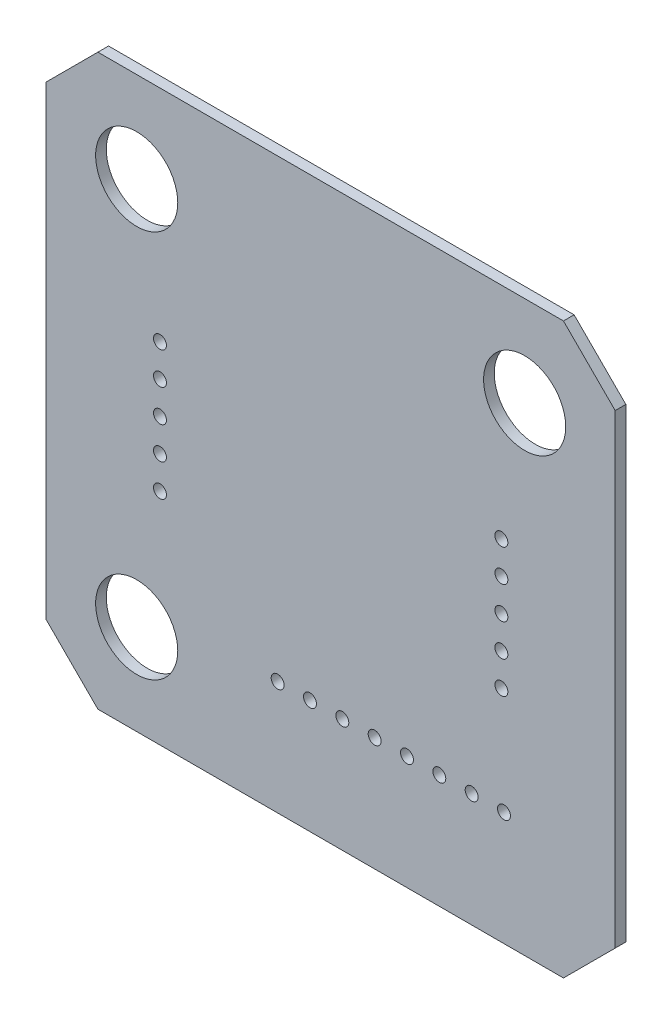
ISO-10303-21;
HEADER;
FILE_DESCRIPTION(('STEP AP214'),'2;1');
FILE_NAME('part.step','',(''),(''),'','','');
FILE_SCHEMA(('AUTOMOTIVE_DESIGN { 1 0 10303 214 1 1 1 1 }'));
ENDSEC;
DATA;
#1=APPLICATION_CONTEXT('core data for automotive mechanical design processes');
#2=APPLICATION_PROTOCOL_DEFINITION('international standard','automotive_design',2000,#1);
#3=PRODUCT_CONTEXT('',#1,'mechanical');
#4=PRODUCT('Part','Part','',(#3));
#5=PRODUCT_RELATED_PRODUCT_CATEGORY('part','',(#4));
#6=PRODUCT_DEFINITION_FORMATION('','',#4);
#7=PRODUCT_DEFINITION_CONTEXT('part definition',#1,'design');
#8=PRODUCT_DEFINITION('design','',#6,#7);
#9=PRODUCT_DEFINITION_SHAPE('','',#8);
#10=(LENGTH_UNIT() NAMED_UNIT(*) SI_UNIT(.MILLI.,.METRE.));
#11=(NAMED_UNIT(*) PLANE_ANGLE_UNIT() SI_UNIT($,.RADIAN.));
#12=(NAMED_UNIT(*) SI_UNIT($,.STERADIAN.) SOLID_ANGLE_UNIT());
#13=UNCERTAINTY_MEASURE_WITH_UNIT(LENGTH_MEASURE(1.E-05),#10,'distance_accuracy_value','');
#14=(GEOMETRIC_REPRESENTATION_CONTEXT(3) GLOBAL_UNCERTAINTY_ASSIGNED_CONTEXT((#13)) GLOBAL_UNIT_ASSIGNED_CONTEXT((#10,
#11,#12)) REPRESENTATION_CONTEXT('',''));
#15=CARTESIAN_POINT('',(0.,0.,0.));
#16=DIRECTION('',(0.,0.,1.));
#17=DIRECTION('',(1.,0.,0.));
#18=AXIS2_PLACEMENT_3D('',#15,#16,#17);
#19=CARTESIAN_POINT('',(-11.,-9.,0.));
#20=DIRECTION('',(-1.,0.,0.));
#21=DIRECTION('',(0.,0.,1.));
#22=AXIS2_PLACEMENT_3D('',#19,#20,#21);
#23=PLANE('',#22);
#24=DIRECTION('',(0.,0.,1.));
#25=VECTOR('',#24,1.);
#26=CARTESIAN_POINT('',(-11.,-9.,0.));
#27=LINE('',#26,#25);
#28=CARTESIAN_POINT('',(-11.,-9.,0.));
#29=VERTEX_POINT('',#28);
#30=CARTESIAN_POINT('',(-11.,-9.,0.41148));
#31=VERTEX_POINT('',#30);
#32=EDGE_CURVE('E11',#29,#31,#27,.T.);
#33=ORIENTED_EDGE('',*,*,#32,.T.);
#34=DIRECTION('',(0.,1.,0.));
#35=VECTOR('',#34,1.);
#36=CARTESIAN_POINT('',(-11.,-9.,0.41148));
#37=LINE('',#36,#35);
#38=CARTESIAN_POINT('',(-11.,9.,0.41148));
#39=VERTEX_POINT('',#38);
#40=EDGE_CURVE('E24',#31,#39,#37,.T.);
#41=ORIENTED_EDGE('',*,*,#40,.T.);
#42=DIRECTION('',(0.,0.,1.));
#43=VECTOR('',#42,1.);
#44=CARTESIAN_POINT('',(-11.,9.,0.));
#45=LINE('',#44,#43);
#46=CARTESIAN_POINT('',(-11.,9.,0.));
#47=VERTEX_POINT('',#46);
#48=EDGE_CURVE('E429',#47,#39,#45,.T.);
#49=ORIENTED_EDGE('',*,*,#48,.F.);
#50=DIRECTION('',(0.,1.,0.));
#51=VECTOR('',#50,1.);
#52=CARTESIAN_POINT('',(-11.,-9.,0.));
#53=LINE('',#52,#51);
#54=EDGE_CURVE('E426',#29,#47,#53,.T.);
#55=ORIENTED_EDGE('',*,*,#54,.F.);
#56=EDGE_LOOP('',(#33,#41,#49,#55));
#57=FACE_BOUND('',#56,.T.);
#58=ADVANCED_FACE('F17',(#57),#23,.T.);
#59=CARTESIAN_POINT('',(-11.,9.,0.));
#60=DIRECTION('',(-0.707106781186548,0.707106781186548,0.));
#61=DIRECTION('',(0.,0.,1.));
#62=AXIS2_PLACEMENT_3D('',#59,#60,#61);
#63=PLANE('',#62);
#64=ORIENTED_EDGE('',*,*,#48,.T.);
#65=DIRECTION('',(0.707106781186548,0.707106781186548,0.));
#66=VECTOR('',#65,1.);
#67=CARTESIAN_POINT('',(-11.,9.,0.41148));
#68=LINE('',#67,#66);
#69=CARTESIAN_POINT('',(-9.,11.,0.41148));
#70=VERTEX_POINT('',#69);
#71=EDGE_CURVE('E424',#39,#70,#68,.T.);
#72=ORIENTED_EDGE('',*,*,#71,.T.);
#73=DIRECTION('',(0.,0.,1.));
#74=VECTOR('',#73,1.);
#75=CARTESIAN_POINT('',(-9.,11.,0.));
#76=LINE('',#75,#74);
#77=CARTESIAN_POINT('',(-9.,11.,0.));
#78=VERTEX_POINT('',#77);
#79=EDGE_CURVE('E421',#78,#70,#76,.T.);
#80=ORIENTED_EDGE('',*,*,#79,.F.);
#81=DIRECTION('',(0.707106781186548,0.707106781186548,0.));
#82=VECTOR('',#81,1.);
#83=CARTESIAN_POINT('',(-11.,9.,0.));
#84=LINE('',#83,#82);
#85=EDGE_CURVE('E418',#47,#78,#84,.T.);
#86=ORIENTED_EDGE('',*,*,#85,.F.);
#87=EDGE_LOOP('',(#64,#72,#80,#86));
#88=FACE_BOUND('',#87,.T.);
#89=ADVANCED_FACE('F433',(#88),#63,.T.);
#90=CARTESIAN_POINT('',(-9.,11.,0.));
#91=DIRECTION('',(0.,1.,0.));
#92=DIRECTION('',(1.,0.,0.));
#93=AXIS2_PLACEMENT_3D('',#90,#91,#92);
#94=PLANE('',#93);
#95=ORIENTED_EDGE('',*,*,#79,.T.);
#96=DIRECTION('',(1.,0.,0.));
#97=VECTOR('',#96,1.);
#98=CARTESIAN_POINT('',(-9.,11.,0.41148));
#99=LINE('',#98,#97);
#100=CARTESIAN_POINT('',(9.,11.,0.41148));
#101=VERTEX_POINT('',#100);
#102=EDGE_CURVE('E416',#70,#101,#99,.T.);
#103=ORIENTED_EDGE('',*,*,#102,.T.);
#104=DIRECTION('',(0.,0.,1.));
#105=VECTOR('',#104,1.);
#106=CARTESIAN_POINT('',(9.,11.,0.));
#107=LINE('',#106,#105);
#108=CARTESIAN_POINT('',(9.,11.,0.));
#109=VERTEX_POINT('',#108);
#110=EDGE_CURVE('E413',#109,#101,#107,.T.);
#111=ORIENTED_EDGE('',*,*,#110,.F.);
#112=DIRECTION('',(1.,0.,0.));
#113=VECTOR('',#112,1.);
#114=CARTESIAN_POINT('',(-9.,11.,0.));
#115=LINE('',#114,#113);
#116=EDGE_CURVE('E410',#78,#109,#115,.T.);
#117=ORIENTED_EDGE('',*,*,#116,.F.);
#118=EDGE_LOOP('',(#95,#103,#111,#117));
#119=FACE_BOUND('',#118,.T.);
#120=ADVANCED_FACE('F442',(#119),#94,.T.);
#121=CARTESIAN_POINT('',(9.,11.,0.));
#122=DIRECTION('',(0.707106781186548,0.707106781186548,0.));
#123=DIRECTION('',(0.,0.,-1.));
#124=AXIS2_PLACEMENT_3D('',#121,#122,#123);
#125=PLANE('',#124);
#126=ORIENTED_EDGE('',*,*,#110,.T.);
#127=DIRECTION('',(0.707106781186548,-0.707106781186548,0.));
#128=VECTOR('',#127,1.);
#129=CARTESIAN_POINT('',(9.,11.,0.41148));
#130=LINE('',#129,#128);
#131=CARTESIAN_POINT('',(11.,9.,0.41148));
#132=VERTEX_POINT('',#131);
#133=EDGE_CURVE('E408',#101,#132,#130,.T.);
#134=ORIENTED_EDGE('',*,*,#133,.T.);
#135=DIRECTION('',(0.,0.,1.));
#136=VECTOR('',#135,1.);
#137=CARTESIAN_POINT('',(11.,9.,0.));
#138=LINE('',#137,#136);
#139=CARTESIAN_POINT('',(11.,9.,0.));
#140=VERTEX_POINT('',#139);
#141=EDGE_CURVE('E405',#140,#132,#138,.T.);
#142=ORIENTED_EDGE('',*,*,#141,.F.);
#143=DIRECTION('',(0.707106781186548,-0.707106781186548,0.));
#144=VECTOR('',#143,1.);
#145=CARTESIAN_POINT('',(9.,11.,0.));
#146=LINE('',#145,#144);
#147=EDGE_CURVE('E402',#109,#140,#146,.T.);
#148=ORIENTED_EDGE('',*,*,#147,.F.);
#149=EDGE_LOOP('',(#126,#134,#142,#148));
#150=FACE_BOUND('',#149,.T.);
#151=ADVANCED_FACE('F446',(#150),#125,.T.);
#152=CARTESIAN_POINT('',(11.,9.,0.));
#153=DIRECTION('',(1.,0.,0.));
#154=DIRECTION('',(0.,1.,0.));
#155=AXIS2_PLACEMENT_3D('',#152,#153,#154);
#156=PLANE('',#155);
#157=ORIENTED_EDGE('',*,*,#141,.T.);
#158=DIRECTION('',(0.,-1.,0.));
#159=VECTOR('',#158,1.);
#160=CARTESIAN_POINT('',(11.,9.,0.41148));
#161=LINE('',#160,#159);
#162=CARTESIAN_POINT('',(11.,-9.,0.41148));
#163=VERTEX_POINT('',#162);
#164=EDGE_CURVE('E400',#132,#163,#161,.T.);
#165=ORIENTED_EDGE('',*,*,#164,.T.);
#166=DIRECTION('',(0.,0.,1.));
#167=VECTOR('',#166,1.);
#168=CARTESIAN_POINT('',(11.,-9.,0.));
#169=LINE('',#168,#167);
#170=CARTESIAN_POINT('',(11.,-9.,0.));
#171=VERTEX_POINT('',#170);
#172=EDGE_CURVE('E397',#171,#163,#169,.T.);
#173=ORIENTED_EDGE('',*,*,#172,.F.);
#174=DIRECTION('',(0.,-1.,0.));
#175=VECTOR('',#174,1.);
#176=CARTESIAN_POINT('',(11.,9.,0.));
#177=LINE('',#176,#175);
#178=EDGE_CURVE('E394',#140,#171,#177,.T.);
#179=ORIENTED_EDGE('',*,*,#178,.F.);
#180=EDGE_LOOP('',(#157,#165,#173,#179));
#181=FACE_BOUND('',#180,.T.);
#182=ADVANCED_FACE('F463',(#181),#156,.T.);
#183=CARTESIAN_POINT('',(11.,-9.,0.));
#184=DIRECTION('',(0.707106781186548,-0.707106781186548,0.));
#185=DIRECTION('',(0.,0.,-1.));
#186=AXIS2_PLACEMENT_3D('',#183,#184,#185);
#187=PLANE('',#186);
#188=ORIENTED_EDGE('',*,*,#172,.T.);
#189=DIRECTION('',(-0.707106781186548,-0.707106781186548,0.));
#190=VECTOR('',#189,1.);
#191=CARTESIAN_POINT('',(11.,-9.,0.41148));
#192=LINE('',#191,#190);
#193=CARTESIAN_POINT('',(9.,-11.,0.41148));
#194=VERTEX_POINT('',#193);
#195=EDGE_CURVE('E392',#163,#194,#192,.T.);
#196=ORIENTED_EDGE('',*,*,#195,.T.);
#197=DIRECTION('',(0.,0.,1.));
#198=VECTOR('',#197,1.);
#199=CARTESIAN_POINT('',(9.,-11.,0.));
#200=LINE('',#199,#198);
#201=CARTESIAN_POINT('',(9.,-11.,0.));
#202=VERTEX_POINT('',#201);
#203=EDGE_CURVE('E389',#202,#194,#200,.T.);
#204=ORIENTED_EDGE('',*,*,#203,.F.);
#205=DIRECTION('',(-0.707106781186548,-0.707106781186548,0.));
#206=VECTOR('',#205,1.);
#207=CARTESIAN_POINT('',(11.,-9.,0.));
#208=LINE('',#207,#206);
#209=EDGE_CURVE('E386',#171,#202,#208,.T.);
#210=ORIENTED_EDGE('',*,*,#209,.F.);
#211=EDGE_LOOP('',(#188,#196,#204,#210));
#212=FACE_BOUND('',#211,.T.);
#213=ADVANCED_FACE('F461',(#212),#187,.T.);
#214=CARTESIAN_POINT('',(9.,-11.,0.));
#215=DIRECTION('',(0.,-1.,0.));
#216=DIRECTION('',(0.,0.,-1.));
#217=AXIS2_PLACEMENT_3D('',#214,#215,#216);
#218=PLANE('',#217);
#219=ORIENTED_EDGE('',*,*,#203,.T.);
#220=DIRECTION('',(-1.,0.,0.));
#221=VECTOR('',#220,1.);
#222=CARTESIAN_POINT('',(9.,-11.,0.41148));
#223=LINE('',#222,#221);
#224=CARTESIAN_POINT('',(-9.,-11.,0.41148));
#225=VERTEX_POINT('',#224);
#226=EDGE_CURVE('E384',#194,#225,#223,.T.);
#227=ORIENTED_EDGE('',*,*,#226,.T.);
#228=DIRECTION('',(0.,0.,1.));
#229=VECTOR('',#228,1.);
#230=CARTESIAN_POINT('',(-9.,-11.,0.));
#231=LINE('',#230,#229);
#232=CARTESIAN_POINT('',(-9.,-11.,0.));
#233=VERTEX_POINT('',#232);
#234=EDGE_CURVE('E381',#233,#225,#231,.T.);
#235=ORIENTED_EDGE('',*,*,#234,.F.);
#236=DIRECTION('',(-1.,0.,0.));
#237=VECTOR('',#236,1.);
#238=CARTESIAN_POINT('',(9.,-11.,0.));
#239=LINE('',#238,#237);
#240=EDGE_CURVE('E378',#202,#233,#239,.T.);
#241=ORIENTED_EDGE('',*,*,#240,.F.);
#242=EDGE_LOOP('',(#219,#227,#235,#241));
#243=FACE_BOUND('',#242,.T.);
#244=ADVANCED_FACE('F457',(#243),#218,.T.);
#245=CARTESIAN_POINT('',(-9.,-11.,0.));
#246=DIRECTION('',(-0.707106781186548,-0.707106781186548,0.));
#247=DIRECTION('',(-0.707106781186548,0.707106781186548,0.));
#248=AXIS2_PLACEMENT_3D('',#245,#246,#247);
#249=PLANE('',#248);
#250=ORIENTED_EDGE('',*,*,#234,.T.);
#251=DIRECTION('',(-0.707106781186548,0.707106781186548,0.));
#252=VECTOR('',#251,1.);
#253=CARTESIAN_POINT('',(-9.,-11.,0.41148));
#254=LINE('',#253,#252);
#255=EDGE_CURVE('E376',#225,#31,#254,.T.);
#256=ORIENTED_EDGE('',*,*,#255,.T.);
#257=ORIENTED_EDGE('',*,*,#32,.F.);
#258=DIRECTION('',(-0.707106781186548,0.707106781186548,0.));
#259=VECTOR('',#258,1.);
#260=CARTESIAN_POINT('',(-9.,-11.,0.));
#261=LINE('',#260,#259);
#262=EDGE_CURVE('E373',#233,#29,#261,.T.);
#263=ORIENTED_EDGE('',*,*,#262,.F.);
#264=EDGE_LOOP('',(#250,#256,#257,#263));
#265=FACE_BOUND('',#264,.T.);
#266=ADVANCED_FACE('F453',(#265),#249,.T.);
#267=CARTESIAN_POINT('',(-7.50000024,-7.50000024,0.));
#268=DIRECTION('',(0.,0.,-1.));
#269=DIRECTION('',(1.,0.,0.));
#270=AXIS2_PLACEMENT_3D('',#267,#268,#269);
#271=CYLINDRICAL_SURFACE('',#270,1.5875);
#272=DIRECTION('',(0.,0.,1.));
#273=VECTOR('',#272,1.);
#274=CARTESIAN_POINT('',(-5.91250024,-7.50000024,0.));
#275=LINE('',#274,#273);
#276=CARTESIAN_POINT('',(-5.91250024,-7.50000024,0.));
#277=VERTEX_POINT('',#276);
#278=CARTESIAN_POINT('',(-5.91250024,-7.50000024,0.41148));
#279=VERTEX_POINT('',#278);
#280=EDGE_CURVE('E371',#277,#279,#275,.T.);
#281=ORIENTED_EDGE('',*,*,#280,.T.);
#282=CARTESIAN_POINT('',(-7.50000024,-7.50000024,0.41148));
#283=DIRECTION('',(0.,0.,1.));
#284=DIRECTION('',(1.,0.,0.));
#285=AXIS2_PLACEMENT_3D('',#282,#283,#284);
#286=CIRCLE('',#285,1.5875);
#287=EDGE_CURVE('E368',#279,#279,#286,.T.);
#288=ORIENTED_EDGE('',*,*,#287,.T.);
#289=ORIENTED_EDGE('',*,*,#280,.F.);
#290=CARTESIAN_POINT('',(-7.50000024,-7.50000024,0.));
#291=DIRECTION('',(0.,0.,1.));
#292=DIRECTION('',(1.,0.,0.));
#293=AXIS2_PLACEMENT_3D('',#290,#291,#292);
#294=CIRCLE('',#293,1.5875);
#295=EDGE_CURVE('E365',#277,#277,#294,.T.);
#296=ORIENTED_EDGE('',*,*,#295,.F.);
#297=EDGE_LOOP('',(#281,#288,#289,#296));
#298=FACE_BOUND('',#297,.T.);
#299=ADVANCED_FACE('F522',(#298),#271,.F.);
#300=CARTESIAN_POINT('',(-6.5999995,-2.50000008,0.));
#301=DIRECTION('',(0.,0.,-1.));
#302=DIRECTION('',(1.,0.,0.));
#303=AXIS2_PLACEMENT_3D('',#300,#301,#302);
#304=CYLINDRICAL_SURFACE('',#303,0.2499995);
#305=DIRECTION('',(0.,0.,1.));
#306=VECTOR('',#305,1.);
#307=CARTESIAN_POINT('',(-6.35,-2.50000008,0.));
#308=LINE('',#307,#306);
#309=CARTESIAN_POINT('',(-6.35,-2.50000008,0.));
#310=VERTEX_POINT('',#309);
#311=CARTESIAN_POINT('',(-6.35,-2.50000008,0.41148));
#312=VERTEX_POINT('',#311);
#313=EDGE_CURVE('E363',#310,#312,#308,.T.);
#314=ORIENTED_EDGE('',*,*,#313,.T.);
#315=CARTESIAN_POINT('',(-6.5999995,-2.50000008,0.41148));
#316=DIRECTION('',(0.,0.,1.));
#317=DIRECTION('',(1.,0.,0.));
#318=AXIS2_PLACEMENT_3D('',#315,#316,#317);
#319=CIRCLE('',#318,0.2499995);
#320=EDGE_CURVE('E360',#312,#312,#319,.T.);
#321=ORIENTED_EDGE('',*,*,#320,.T.);
#322=ORIENTED_EDGE('',*,*,#313,.F.);
#323=CARTESIAN_POINT('',(-6.5999995,-2.50000008,0.));
#324=DIRECTION('',(0.,0.,1.));
#325=DIRECTION('',(1.,0.,0.));
#326=AXIS2_PLACEMENT_3D('',#323,#324,#325);
#327=CIRCLE('',#326,0.2499995);
#328=EDGE_CURVE('E357',#310,#310,#327,.T.);
#329=ORIENTED_EDGE('',*,*,#328,.F.);
#330=EDGE_LOOP('',(#314,#321,#322,#329));
#331=FACE_BOUND('',#330,.T.);
#332=ADVANCED_FACE('F531',(#331),#304,.F.);
#333=CARTESIAN_POINT('',(0.4499991,-6.5999995,0.));
#334=DIRECTION('',(0.,0.,-1.));
#335=DIRECTION('',(1.,0.,0.));
#336=AXIS2_PLACEMENT_3D('',#333,#334,#335);
#337=CYLINDRICAL_SURFACE('',#336,0.2499995);
#338=DIRECTION('',(0.,0.,1.));
#339=VECTOR('',#338,1.);
#340=CARTESIAN_POINT('',(0.6999986,-6.5999995,0.));
#341=LINE('',#340,#339);
#342=CARTESIAN_POINT('',(0.6999986,-6.5999995,0.));
#343=VERTEX_POINT('',#342);
#344=CARTESIAN_POINT('',(0.6999986,-6.5999995,0.41148));
#345=VERTEX_POINT('',#344);
#346=EDGE_CURVE('E355',#343,#345,#341,.T.);
#347=ORIENTED_EDGE('',*,*,#346,.T.);
#348=CARTESIAN_POINT('',(0.4499991,-6.5999995,0.41148));
#349=DIRECTION('',(0.,0.,1.));
#350=DIRECTION('',(1.,0.,0.));
#351=AXIS2_PLACEMENT_3D('',#348,#349,#350);
#352=CIRCLE('',#351,0.2499995);
#353=EDGE_CURVE('E352',#345,#345,#352,.T.);
#354=ORIENTED_EDGE('',*,*,#353,.T.);
#355=ORIENTED_EDGE('',*,*,#346,.F.);
#356=CARTESIAN_POINT('',(0.4499991,-6.5999995,0.));
#357=DIRECTION('',(0.,0.,1.));
#358=DIRECTION('',(1.,0.,0.));
#359=AXIS2_PLACEMENT_3D('',#356,#357,#358);
#360=CIRCLE('',#359,0.2499995);
#361=EDGE_CURVE('E349',#343,#343,#360,.T.);
#362=ORIENTED_EDGE('',*,*,#361,.F.);
#363=EDGE_LOOP('',(#347,#354,#355,#362));
#364=FACE_BOUND('',#363,.T.);
#365=ADVANCED_FACE('F541',(#364),#337,.F.);
#366=CARTESIAN_POINT('',(-2.05000098,-6.5999995,0.));
#367=DIRECTION('',(0.,0.,-1.));
#368=DIRECTION('',(1.,0.,0.));
#369=AXIS2_PLACEMENT_3D('',#366,#367,#368);
#370=CYLINDRICAL_SURFACE('',#369,0.2499995);
#371=DIRECTION('',(0.,0.,1.));
#372=VECTOR('',#371,1.);
#373=CARTESIAN_POINT('',(-1.80000148,-6.5999995,0.));
#374=LINE('',#373,#372);
#375=CARTESIAN_POINT('',(-1.80000148,-6.5999995,0.));
#376=VERTEX_POINT('',#375);
#377=CARTESIAN_POINT('',(-1.80000148,-6.5999995,0.41148));
#378=VERTEX_POINT('',#377);
#379=EDGE_CURVE('E347',#376,#378,#374,.T.);
#380=ORIENTED_EDGE('',*,*,#379,.T.);
#381=CARTESIAN_POINT('',(-2.05000098,-6.5999995,0.41148));
#382=DIRECTION('',(0.,0.,1.));
#383=DIRECTION('',(1.,0.,0.));
#384=AXIS2_PLACEMENT_3D('',#381,#382,#383);
#385=CIRCLE('',#384,0.2499995);
#386=EDGE_CURVE('E344',#378,#378,#385,.T.);
#387=ORIENTED_EDGE('',*,*,#386,.T.);
#388=ORIENTED_EDGE('',*,*,#379,.F.);
#389=CARTESIAN_POINT('',(-2.05000098,-6.5999995,0.));
#390=DIRECTION('',(0.,0.,1.));
#391=DIRECTION('',(1.,0.,0.));
#392=AXIS2_PLACEMENT_3D('',#389,#390,#391);
#393=CIRCLE('',#392,0.2499995);
#394=EDGE_CURVE('E341',#376,#376,#393,.T.);
#395=ORIENTED_EDGE('',*,*,#394,.F.);
#396=EDGE_LOOP('',(#380,#387,#388,#395));
#397=FACE_BOUND('',#396,.T.);
#398=ADVANCED_FACE('F551',(#397),#370,.F.);
#399=CARTESIAN_POINT('',(-0.80000094,-6.5999995,0.));
#400=DIRECTION('',(0.,0.,-1.));
#401=DIRECTION('',(1.,0.,0.));
#402=AXIS2_PLACEMENT_3D('',#399,#400,#401);
#403=CYLINDRICAL_SURFACE('',#402,0.2499995);
#404=DIRECTION('',(0.,0.,1.));
#405=VECTOR('',#404,1.);
#406=CARTESIAN_POINT('',(-0.55000144,-6.5999995,0.));
#407=LINE('',#406,#405);
#408=CARTESIAN_POINT('',(-0.55000144,-6.5999995,0.));
#409=VERTEX_POINT('',#408);
#410=CARTESIAN_POINT('',(-0.55000144,-6.5999995,0.41148));
#411=VERTEX_POINT('',#410);
#412=EDGE_CURVE('E339',#409,#411,#407,.T.);
#413=ORIENTED_EDGE('',*,*,#412,.T.);
#414=CARTESIAN_POINT('',(-0.80000094,-6.5999995,0.41148));
#415=DIRECTION('',(0.,0.,1.));
#416=DIRECTION('',(1.,0.,0.));
#417=AXIS2_PLACEMENT_3D('',#414,#415,#416);
#418=CIRCLE('',#417,0.2499995);
#419=EDGE_CURVE('E336',#411,#411,#418,.T.);
#420=ORIENTED_EDGE('',*,*,#419,.T.);
#421=ORIENTED_EDGE('',*,*,#412,.F.);
#422=CARTESIAN_POINT('',(-0.80000094,-6.5999995,0.));
#423=DIRECTION('',(0.,0.,1.));
#424=DIRECTION('',(1.,0.,0.));
#425=AXIS2_PLACEMENT_3D('',#422,#423,#424);
#426=CIRCLE('',#425,0.2499995);
#427=EDGE_CURVE('E333',#409,#409,#426,.T.);
#428=ORIENTED_EDGE('',*,*,#427,.F.);
#429=EDGE_LOOP('',(#413,#420,#421,#428));
#430=FACE_BOUND('',#429,.T.);
#431=ADVANCED_FACE('F561',(#430),#403,.F.);
#432=CARTESIAN_POINT('',(-6.5999995,-1.25000004,0.));
#433=DIRECTION('',(0.,0.,-1.));
#434=DIRECTION('',(1.,0.,0.));
#435=AXIS2_PLACEMENT_3D('',#432,#433,#434);
#436=CYLINDRICAL_SURFACE('',#435,0.2499995);
#437=DIRECTION('',(0.,0.,1.));
#438=VECTOR('',#437,1.);
#439=CARTESIAN_POINT('',(-6.35,-1.25000004,0.));
#440=LINE('',#439,#438);
#441=CARTESIAN_POINT('',(-6.35,-1.25000004,0.));
#442=VERTEX_POINT('',#441);
#443=CARTESIAN_POINT('',(-6.35,-1.25000004,0.41148));
#444=VERTEX_POINT('',#443);
#445=EDGE_CURVE('E331',#442,#444,#440,.T.);
#446=ORIENTED_EDGE('',*,*,#445,.T.);
#447=CARTESIAN_POINT('',(-6.5999995,-1.25000004,0.41148));
#448=DIRECTION('',(0.,0.,1.));
#449=DIRECTION('',(1.,0.,0.));
#450=AXIS2_PLACEMENT_3D('',#447,#448,#449);
#451=CIRCLE('',#450,0.2499995);
#452=EDGE_CURVE('E328',#444,#444,#451,.T.);
#453=ORIENTED_EDGE('',*,*,#452,.T.);
#454=ORIENTED_EDGE('',*,*,#445,.F.);
#455=CARTESIAN_POINT('',(-6.5999995,-1.25000004,0.));
#456=DIRECTION('',(0.,0.,1.));
#457=DIRECTION('',(1.,0.,0.));
#458=AXIS2_PLACEMENT_3D('',#455,#456,#457);
#459=CIRCLE('',#458,0.2499995);
#460=EDGE_CURVE('E325',#442,#442,#459,.T.);
#461=ORIENTED_EDGE('',*,*,#460,.F.);
#462=EDGE_LOOP('',(#446,#453,#454,#461));
#463=FACE_BOUND('',#462,.T.);
#464=ADVANCED_FACE('F571',(#463),#436,.F.);
#465=CARTESIAN_POINT('',(-6.5999995,0.,0.));
#466=DIRECTION('',(0.,0.,-1.));
#467=DIRECTION('',(1.,0.,0.));
#468=AXIS2_PLACEMENT_3D('',#465,#466,#467);
#469=CYLINDRICAL_SURFACE('',#468,0.2499995);
#470=DIRECTION('',(0.,0.,1.));
#471=VECTOR('',#470,1.);
#472=CARTESIAN_POINT('',(-6.35,0.,0.));
#473=LINE('',#472,#471);
#474=CARTESIAN_POINT('',(-6.35,0.,0.));
#475=VERTEX_POINT('',#474);
#476=CARTESIAN_POINT('',(-6.35,0.,0.41148));
#477=VERTEX_POINT('',#476);
#478=EDGE_CURVE('E323',#475,#477,#473,.T.);
#479=ORIENTED_EDGE('',*,*,#478,.T.);
#480=CARTESIAN_POINT('',(-6.5999995,0.,0.41148));
#481=DIRECTION('',(0.,0.,1.));
#482=DIRECTION('',(1.,0.,0.));
#483=AXIS2_PLACEMENT_3D('',#480,#481,#482);
#484=CIRCLE('',#483,0.2499995);
#485=EDGE_CURVE('E320',#477,#477,#484,.T.);
#486=ORIENTED_EDGE('',*,*,#485,.T.);
#487=ORIENTED_EDGE('',*,*,#478,.F.);
#488=CARTESIAN_POINT('',(-6.5999995,0.,0.));
#489=DIRECTION('',(0.,0.,1.));
#490=DIRECTION('',(1.,0.,0.));
#491=AXIS2_PLACEMENT_3D('',#488,#489,#490);
#492=CIRCLE('',#491,0.2499995);
#493=EDGE_CURVE('E317',#475,#475,#492,.T.);
#494=ORIENTED_EDGE('',*,*,#493,.F.);
#495=EDGE_LOOP('',(#479,#486,#487,#494));
#496=FACE_BOUND('',#495,.T.);
#497=ADVANCED_FACE('F581',(#496),#469,.F.);
#498=CARTESIAN_POINT('',(-6.5999995,1.25000004,0.));
#499=DIRECTION('',(0.,0.,-1.));
#500=DIRECTION('',(1.,0.,0.));
#501=AXIS2_PLACEMENT_3D('',#498,#499,#500);
#502=CYLINDRICAL_SURFACE('',#501,0.2499995);
#503=DIRECTION('',(0.,0.,1.));
#504=VECTOR('',#503,1.);
#505=CARTESIAN_POINT('',(-6.35,1.25000004,0.));
#506=LINE('',#505,#504);
#507=CARTESIAN_POINT('',(-6.35,1.25000004,0.));
#508=VERTEX_POINT('',#507);
#509=CARTESIAN_POINT('',(-6.35,1.25000004,0.41148));
#510=VERTEX_POINT('',#509);
#511=EDGE_CURVE('E315',#508,#510,#506,.T.);
#512=ORIENTED_EDGE('',*,*,#511,.T.);
#513=CARTESIAN_POINT('',(-6.5999995,1.25000004,0.41148));
#514=DIRECTION('',(0.,0.,1.));
#515=DIRECTION('',(1.,0.,0.));
#516=AXIS2_PLACEMENT_3D('',#513,#514,#515);
#517=CIRCLE('',#516,0.2499995);
#518=EDGE_CURVE('E312',#510,#510,#517,.T.);
#519=ORIENTED_EDGE('',*,*,#518,.T.);
#520=ORIENTED_EDGE('',*,*,#511,.F.);
#521=CARTESIAN_POINT('',(-6.5999995,1.25000004,0.));
#522=DIRECTION('',(0.,0.,1.));
#523=DIRECTION('',(1.,0.,0.));
#524=AXIS2_PLACEMENT_3D('',#521,#522,#523);
#525=CIRCLE('',#524,0.2499995);
#526=EDGE_CURVE('E309',#508,#508,#525,.T.);
#527=ORIENTED_EDGE('',*,*,#526,.F.);
#528=EDGE_LOOP('',(#512,#519,#520,#527));
#529=FACE_BOUND('',#528,.T.);
#530=ADVANCED_FACE('F591',(#529),#502,.F.);
#531=CARTESIAN_POINT('',(-7.50000024,7.50000024,0.));
#532=DIRECTION('',(0.,0.,-1.));
#533=DIRECTION('',(1.,0.,0.));
#534=AXIS2_PLACEMENT_3D('',#531,#532,#533);
#535=CYLINDRICAL_SURFACE('',#534,1.5875);
#536=DIRECTION('',(0.,0.,1.));
#537=VECTOR('',#536,1.);
#538=CARTESIAN_POINT('',(-5.91250024,7.50000024,0.));
#539=LINE('',#538,#537);
#540=CARTESIAN_POINT('',(-5.91250024,7.50000024,0.));
#541=VERTEX_POINT('',#540);
#542=CARTESIAN_POINT('',(-5.91250024,7.50000024,0.41148));
#543=VERTEX_POINT('',#542);
#544=EDGE_CURVE('E307',#541,#543,#539,.T.);
#545=ORIENTED_EDGE('',*,*,#544,.T.);
#546=CARTESIAN_POINT('',(-7.50000024,7.50000024,0.41148));
#547=DIRECTION('',(0.,0.,1.));
#548=DIRECTION('',(1.,0.,0.));
#549=AXIS2_PLACEMENT_3D('',#546,#547,#548);
#550=CIRCLE('',#549,1.5875);
#551=EDGE_CURVE('E304',#543,#543,#550,.T.);
#552=ORIENTED_EDGE('',*,*,#551,.T.);
#553=ORIENTED_EDGE('',*,*,#544,.F.);
#554=CARTESIAN_POINT('',(-7.50000024,7.50000024,0.));
#555=DIRECTION('',(0.,0.,1.));
#556=DIRECTION('',(1.,0.,0.));
#557=AXIS2_PLACEMENT_3D('',#554,#555,#556);
#558=CIRCLE('',#557,1.5875);
#559=EDGE_CURVE('E301',#541,#541,#558,.T.);
#560=ORIENTED_EDGE('',*,*,#559,.F.);
#561=EDGE_LOOP('',(#545,#552,#553,#560));
#562=FACE_BOUND('',#561,.T.);
#563=ADVANCED_FACE('F601',(#562),#535,.F.);
#564=CARTESIAN_POINT('',(-6.5999995,2.50000008,0.));
#565=DIRECTION('',(0.,0.,-1.));
#566=DIRECTION('',(1.,0.,0.));
#567=AXIS2_PLACEMENT_3D('',#564,#565,#566);
#568=CYLINDRICAL_SURFACE('',#567,0.2499995);
#569=DIRECTION('',(0.,0.,1.));
#570=VECTOR('',#569,1.);
#571=CARTESIAN_POINT('',(-6.35,2.50000008,0.));
#572=LINE('',#571,#570);
#573=CARTESIAN_POINT('',(-6.35,2.50000008,0.));
#574=VERTEX_POINT('',#573);
#575=CARTESIAN_POINT('',(-6.35,2.50000008,0.41148));
#576=VERTEX_POINT('',#575);
#577=EDGE_CURVE('E299',#574,#576,#572,.T.);
#578=ORIENTED_EDGE('',*,*,#577,.T.);
#579=CARTESIAN_POINT('',(-6.5999995,2.50000008,0.41148));
#580=DIRECTION('',(0.,0.,1.));
#581=DIRECTION('',(1.,0.,0.));
#582=AXIS2_PLACEMENT_3D('',#579,#580,#581);
#583=CIRCLE('',#582,0.2499995);
#584=EDGE_CURVE('E296',#576,#576,#583,.T.);
#585=ORIENTED_EDGE('',*,*,#584,.T.);
#586=ORIENTED_EDGE('',*,*,#577,.F.);
#587=CARTESIAN_POINT('',(-6.5999995,2.50000008,0.));
#588=DIRECTION('',(0.,0.,1.));
#589=DIRECTION('',(1.,0.,0.));
#590=AXIS2_PLACEMENT_3D('',#587,#588,#589);
#591=CIRCLE('',#590,0.2499995);
#592=EDGE_CURVE('E293',#574,#574,#591,.T.);
#593=ORIENTED_EDGE('',*,*,#592,.F.);
#594=EDGE_LOOP('',(#578,#585,#586,#593));
#595=FACE_BOUND('',#594,.T.);
#596=ADVANCED_FACE('F611',(#595),#568,.F.);
#597=CARTESIAN_POINT('',(2.94999918,-6.5999995,0.));
#598=DIRECTION('',(0.,0.,-1.));
#599=DIRECTION('',(1.,0.,0.));
#600=AXIS2_PLACEMENT_3D('',#597,#598,#599);
#601=CYLINDRICAL_SURFACE('',#600,0.2499995);
#602=DIRECTION('',(0.,0.,1.));
#603=VECTOR('',#602,1.);
#604=CARTESIAN_POINT('',(3.19999868,-6.5999995,0.));
#605=LINE('',#604,#603);
#606=CARTESIAN_POINT('',(3.19999868,-6.5999995,0.));
#607=VERTEX_POINT('',#606);
#608=CARTESIAN_POINT('',(3.19999868,-6.5999995,0.41148));
#609=VERTEX_POINT('',#608);
#610=EDGE_CURVE('E291',#607,#609,#605,.T.);
#611=ORIENTED_EDGE('',*,*,#610,.T.);
#612=CARTESIAN_POINT('',(2.94999918,-6.5999995,0.41148));
#613=DIRECTION('',(0.,0.,1.));
#614=DIRECTION('',(1.,0.,0.));
#615=AXIS2_PLACEMENT_3D('',#612,#613,#614);
#616=CIRCLE('',#615,0.2499995);
#617=EDGE_CURVE('E288',#609,#609,#616,.T.);
#618=ORIENTED_EDGE('',*,*,#617,.T.);
#619=ORIENTED_EDGE('',*,*,#610,.F.);
#620=CARTESIAN_POINT('',(2.94999918,-6.5999995,0.));
#621=DIRECTION('',(0.,0.,1.));
#622=DIRECTION('',(1.,0.,0.));
#623=AXIS2_PLACEMENT_3D('',#620,#621,#622);
#624=CIRCLE('',#623,0.2499995);
#625=EDGE_CURVE('E285',#607,#607,#624,.T.);
#626=ORIENTED_EDGE('',*,*,#625,.F.);
#627=EDGE_LOOP('',(#611,#618,#619,#626));
#628=FACE_BOUND('',#627,.T.);
#629=ADVANCED_FACE('F621',(#628),#601,.F.);
#630=CARTESIAN_POINT('',(1.69999914,-6.5999995,0.));
#631=DIRECTION('',(0.,0.,-1.));
#632=DIRECTION('',(1.,0.,0.));
#633=AXIS2_PLACEMENT_3D('',#630,#631,#632);
#634=CYLINDRICAL_SURFACE('',#633,0.2499995);
#635=DIRECTION('',(0.,0.,1.));
#636=VECTOR('',#635,1.);
#637=CARTESIAN_POINT('',(1.94999864,-6.5999995,0.));
#638=LINE('',#637,#636);
#639=CARTESIAN_POINT('',(1.94999864,-6.5999995,0.));
#640=VERTEX_POINT('',#639);
#641=CARTESIAN_POINT('',(1.94999864,-6.5999995,0.41148));
#642=VERTEX_POINT('',#641);
#643=EDGE_CURVE('E283',#640,#642,#638,.T.);
#644=ORIENTED_EDGE('',*,*,#643,.T.);
#645=CARTESIAN_POINT('',(1.69999914,-6.5999995,0.41148));
#646=DIRECTION('',(0.,0.,1.));
#647=DIRECTION('',(1.,0.,0.));
#648=AXIS2_PLACEMENT_3D('',#645,#646,#647);
#649=CIRCLE('',#648,0.2499995);
#650=EDGE_CURVE('E280',#642,#642,#649,.T.);
#651=ORIENTED_EDGE('',*,*,#650,.T.);
#652=ORIENTED_EDGE('',*,*,#643,.F.);
#653=CARTESIAN_POINT('',(1.69999914,-6.5999995,0.));
#654=DIRECTION('',(0.,0.,1.));
#655=DIRECTION('',(1.,0.,0.));
#656=AXIS2_PLACEMENT_3D('',#653,#654,#655);
#657=CIRCLE('',#656,0.2499995);
#658=EDGE_CURVE('E277',#640,#640,#657,.T.);
#659=ORIENTED_EDGE('',*,*,#658,.F.);
#660=EDGE_LOOP('',(#644,#651,#652,#659));
#661=FACE_BOUND('',#660,.T.);
#662=ADVANCED_FACE('F631',(#661),#634,.F.);
#663=CARTESIAN_POINT('',(6.6999993,-6.5999995,0.));
#664=DIRECTION('',(0.,0.,-1.));
#665=DIRECTION('',(1.,0.,0.));
#666=AXIS2_PLACEMENT_3D('',#663,#664,#665);
#667=CYLINDRICAL_SURFACE('',#666,0.2499995);
#668=DIRECTION('',(0.,0.,1.));
#669=VECTOR('',#668,1.);
#670=CARTESIAN_POINT('',(6.9499988,-6.5999995,0.));
#671=LINE('',#670,#669);
#672=CARTESIAN_POINT('',(6.9499988,-6.5999995,0.));
#673=VERTEX_POINT('',#672);
#674=CARTESIAN_POINT('',(6.9499988,-6.5999995,0.41148));
#675=VERTEX_POINT('',#674);
#676=EDGE_CURVE('E275',#673,#675,#671,.T.);
#677=ORIENTED_EDGE('',*,*,#676,.T.);
#678=CARTESIAN_POINT('',(6.6999993,-6.5999995,0.41148));
#679=DIRECTION('',(0.,0.,1.));
#680=DIRECTION('',(1.,0.,0.));
#681=AXIS2_PLACEMENT_3D('',#678,#679,#680);
#682=CIRCLE('',#681,0.2499995);
#683=EDGE_CURVE('E272',#675,#675,#682,.T.);
#684=ORIENTED_EDGE('',*,*,#683,.T.);
#685=ORIENTED_EDGE('',*,*,#676,.F.);
#686=CARTESIAN_POINT('',(6.6999993,-6.5999995,0.));
#687=DIRECTION('',(0.,0.,1.));
#688=DIRECTION('',(1.,0.,0.));
#689=AXIS2_PLACEMENT_3D('',#686,#687,#688);
#690=CIRCLE('',#689,0.2499995);
#691=EDGE_CURVE('E269',#673,#673,#690,.T.);
#692=ORIENTED_EDGE('',*,*,#691,.F.);
#693=EDGE_LOOP('',(#677,#684,#685,#692));
#694=FACE_BOUND('',#693,.T.);
#695=ADVANCED_FACE('F641',(#694),#667,.F.);
#696=CARTESIAN_POINT('',(4.19999922,-6.5999995,0.));
#697=DIRECTION('',(0.,0.,-1.));
#698=DIRECTION('',(1.,0.,0.));
#699=AXIS2_PLACEMENT_3D('',#696,#697,#698);
#700=CYLINDRICAL_SURFACE('',#699,0.2499995);
#701=DIRECTION('',(0.,0.,1.));
#702=VECTOR('',#701,1.);
#703=CARTESIAN_POINT('',(4.44999872,-6.5999995,0.));
#704=LINE('',#703,#702);
#705=CARTESIAN_POINT('',(4.44999872,-6.5999995,0.));
#706=VERTEX_POINT('',#705);
#707=CARTESIAN_POINT('',(4.44999872,-6.5999995,0.41148));
#708=VERTEX_POINT('',#707);
#709=EDGE_CURVE('E267',#706,#708,#704,.T.);
#710=ORIENTED_EDGE('',*,*,#709,.T.);
#711=CARTESIAN_POINT('',(4.19999922,-6.5999995,0.41148));
#712=DIRECTION('',(0.,0.,1.));
#713=DIRECTION('',(1.,0.,0.));
#714=AXIS2_PLACEMENT_3D('',#711,#712,#713);
#715=CIRCLE('',#714,0.2499995);
#716=EDGE_CURVE('E264',#708,#708,#715,.T.);
#717=ORIENTED_EDGE('',*,*,#716,.T.);
#718=ORIENTED_EDGE('',*,*,#709,.F.);
#719=CARTESIAN_POINT('',(4.19999922,-6.5999995,0.));
#720=DIRECTION('',(0.,0.,1.));
#721=DIRECTION('',(1.,0.,0.));
#722=AXIS2_PLACEMENT_3D('',#719,#720,#721);
#723=CIRCLE('',#722,0.2499995);
#724=EDGE_CURVE('E261',#706,#706,#723,.T.);
#725=ORIENTED_EDGE('',*,*,#724,.F.);
#726=EDGE_LOOP('',(#710,#717,#718,#725));
#727=FACE_BOUND('',#726,.T.);
#728=ADVANCED_FACE('F651',(#727),#700,.F.);
#729=CARTESIAN_POINT('',(5.44999926,-6.5999995,0.));
#730=DIRECTION('',(0.,0.,-1.));
#731=DIRECTION('',(1.,0.,0.));
#732=AXIS2_PLACEMENT_3D('',#729,#730,#731);
#733=CYLINDRICAL_SURFACE('',#732,0.2499995);
#734=DIRECTION('',(0.,0.,1.));
#735=VECTOR('',#734,1.);
#736=CARTESIAN_POINT('',(5.69999876,-6.5999995,0.));
#737=LINE('',#736,#735);
#738=CARTESIAN_POINT('',(5.69999876,-6.5999995,0.));
#739=VERTEX_POINT('',#738);
#740=CARTESIAN_POINT('',(5.69999876,-6.5999995,0.41148));
#741=VERTEX_POINT('',#740);
#742=EDGE_CURVE('E259',#739,#741,#737,.T.);
#743=ORIENTED_EDGE('',*,*,#742,.T.);
#744=CARTESIAN_POINT('',(5.44999926,-6.5999995,0.41148));
#745=DIRECTION('',(0.,0.,1.));
#746=DIRECTION('',(1.,0.,0.));
#747=AXIS2_PLACEMENT_3D('',#744,#745,#746);
#748=CIRCLE('',#747,0.2499995);
#749=EDGE_CURVE('E256',#741,#741,#748,.T.);
#750=ORIENTED_EDGE('',*,*,#749,.T.);
#751=ORIENTED_EDGE('',*,*,#742,.F.);
#752=CARTESIAN_POINT('',(5.44999926,-6.5999995,0.));
#753=DIRECTION('',(0.,0.,1.));
#754=DIRECTION('',(1.,0.,0.));
#755=AXIS2_PLACEMENT_3D('',#752,#753,#754);
#756=CIRCLE('',#755,0.2499995);
#757=EDGE_CURVE('E253',#739,#739,#756,.T.);
#758=ORIENTED_EDGE('',*,*,#757,.F.);
#759=EDGE_LOOP('',(#743,#750,#751,#758));
#760=FACE_BOUND('',#759,.T.);
#761=ADVANCED_FACE('F661',(#760),#733,.F.);
#762=CARTESIAN_POINT('',(6.5999995,-2.50000008,0.));
#763=DIRECTION('',(0.,0.,-1.));
#764=DIRECTION('',(1.,0.,0.));
#765=AXIS2_PLACEMENT_3D('',#762,#763,#764);
#766=CYLINDRICAL_SURFACE('',#765,0.2499995);
#767=DIRECTION('',(0.,0.,1.));
#768=VECTOR('',#767,1.);
#769=CARTESIAN_POINT('',(6.849999,-2.50000008,0.));
#770=LINE('',#769,#768);
#771=CARTESIAN_POINT('',(6.849999,-2.50000008,0.));
#772=VERTEX_POINT('',#771);
#773=CARTESIAN_POINT('',(6.849999,-2.50000008,0.41148));
#774=VERTEX_POINT('',#773);
#775=EDGE_CURVE('E251',#772,#774,#770,.T.);
#776=ORIENTED_EDGE('',*,*,#775,.T.);
#777=CARTESIAN_POINT('',(6.5999995,-2.50000008,0.41148));
#778=DIRECTION('',(0.,0.,1.));
#779=DIRECTION('',(1.,0.,0.));
#780=AXIS2_PLACEMENT_3D('',#777,#778,#779);
#781=CIRCLE('',#780,0.2499995);
#782=EDGE_CURVE('E248',#774,#774,#781,.T.);
#783=ORIENTED_EDGE('',*,*,#782,.T.);
#784=ORIENTED_EDGE('',*,*,#775,.F.);
#785=CARTESIAN_POINT('',(6.5999995,-2.50000008,0.));
#786=DIRECTION('',(0.,0.,1.));
#787=DIRECTION('',(1.,0.,0.));
#788=AXIS2_PLACEMENT_3D('',#785,#786,#787);
#789=CIRCLE('',#788,0.2499995);
#790=EDGE_CURVE('E245',#772,#772,#789,.T.);
#791=ORIENTED_EDGE('',*,*,#790,.F.);
#792=EDGE_LOOP('',(#776,#783,#784,#791));
#793=FACE_BOUND('',#792,.T.);
#794=ADVANCED_FACE('F671',(#793),#766,.F.);
#795=CARTESIAN_POINT('',(6.5999995,0.,0.));
#796=DIRECTION('',(0.,0.,-1.));
#797=DIRECTION('',(1.,0.,0.));
#798=AXIS2_PLACEMENT_3D('',#795,#796,#797);
#799=CYLINDRICAL_SURFACE('',#798,0.2499995);
#800=DIRECTION('',(0.,0.,1.));
#801=VECTOR('',#800,1.);
#802=CARTESIAN_POINT('',(6.849999,0.,0.));
#803=LINE('',#802,#801);
#804=CARTESIAN_POINT('',(6.849999,0.,0.));
#805=VERTEX_POINT('',#804);
#806=CARTESIAN_POINT('',(6.849999,0.,0.41148));
#807=VERTEX_POINT('',#806);
#808=EDGE_CURVE('E243',#805,#807,#803,.T.);
#809=ORIENTED_EDGE('',*,*,#808,.T.);
#810=CARTESIAN_POINT('',(6.5999995,0.,0.41148));
#811=DIRECTION('',(0.,0.,1.));
#812=DIRECTION('',(1.,0.,0.));
#813=AXIS2_PLACEMENT_3D('',#810,#811,#812);
#814=CIRCLE('',#813,0.2499995);
#815=EDGE_CURVE('E240',#807,#807,#814,.T.);
#816=ORIENTED_EDGE('',*,*,#815,.T.);
#817=ORIENTED_EDGE('',*,*,#808,.F.);
#818=CARTESIAN_POINT('',(6.5999995,0.,0.));
#819=DIRECTION('',(0.,0.,1.));
#820=DIRECTION('',(1.,0.,0.));
#821=AXIS2_PLACEMENT_3D('',#818,#819,#820);
#822=CIRCLE('',#821,0.2499995);
#823=EDGE_CURVE('E237',#805,#805,#822,.T.);
#824=ORIENTED_EDGE('',*,*,#823,.F.);
#825=EDGE_LOOP('',(#809,#816,#817,#824));
#826=FACE_BOUND('',#825,.T.);
#827=ADVANCED_FACE('F681',(#826),#799,.F.);
#828=CARTESIAN_POINT('',(6.5999995,-1.25000004,0.));
#829=DIRECTION('',(0.,0.,-1.));
#830=DIRECTION('',(1.,0.,0.));
#831=AXIS2_PLACEMENT_3D('',#828,#829,#830);
#832=CYLINDRICAL_SURFACE('',#831,0.2499995);
#833=DIRECTION('',(0.,0.,1.));
#834=VECTOR('',#833,1.);
#835=CARTESIAN_POINT('',(6.849999,-1.25000004,0.));
#836=LINE('',#835,#834);
#837=CARTESIAN_POINT('',(6.849999,-1.25000004,0.));
#838=VERTEX_POINT('',#837);
#839=CARTESIAN_POINT('',(6.849999,-1.25000004,0.41148));
#840=VERTEX_POINT('',#839);
#841=EDGE_CURVE('E235',#838,#840,#836,.T.);
#842=ORIENTED_EDGE('',*,*,#841,.T.);
#843=CARTESIAN_POINT('',(6.5999995,-1.25000004,0.41148));
#844=DIRECTION('',(0.,0.,1.));
#845=DIRECTION('',(1.,0.,0.));
#846=AXIS2_PLACEMENT_3D('',#843,#844,#845);
#847=CIRCLE('',#846,0.2499995);
#848=EDGE_CURVE('E232',#840,#840,#847,.T.);
#849=ORIENTED_EDGE('',*,*,#848,.T.);
#850=ORIENTED_EDGE('',*,*,#841,.F.);
#851=CARTESIAN_POINT('',(6.5999995,-1.25000004,0.));
#852=DIRECTION('',(0.,0.,1.));
#853=DIRECTION('',(1.,0.,0.));
#854=AXIS2_PLACEMENT_3D('',#851,#852,#853);
#855=CIRCLE('',#854,0.2499995);
#856=EDGE_CURVE('E229',#838,#838,#855,.T.);
#857=ORIENTED_EDGE('',*,*,#856,.F.);
#858=EDGE_LOOP('',(#842,#849,#850,#857));
#859=FACE_BOUND('',#858,.T.);
#860=ADVANCED_FACE('F691',(#859),#832,.F.);
#861=CARTESIAN_POINT('',(6.5999995,1.25000004,0.));
#862=DIRECTION('',(0.,0.,-1.));
#863=DIRECTION('',(1.,0.,0.));
#864=AXIS2_PLACEMENT_3D('',#861,#862,#863);
#865=CYLINDRICAL_SURFACE('',#864,0.2499995);
#866=DIRECTION('',(0.,0.,1.));
#867=VECTOR('',#866,1.);
#868=CARTESIAN_POINT('',(6.849999,1.25000004,0.));
#869=LINE('',#868,#867);
#870=CARTESIAN_POINT('',(6.849999,1.25000004,0.));
#871=VERTEX_POINT('',#870);
#872=CARTESIAN_POINT('',(6.849999,1.25000004,0.41148));
#873=VERTEX_POINT('',#872);
#874=EDGE_CURVE('E227',#871,#873,#869,.T.);
#875=ORIENTED_EDGE('',*,*,#874,.T.);
#876=CARTESIAN_POINT('',(6.5999995,1.25000004,0.41148));
#877=DIRECTION('',(0.,0.,1.));
#878=DIRECTION('',(1.,0.,0.));
#879=AXIS2_PLACEMENT_3D('',#876,#877,#878);
#880=CIRCLE('',#879,0.2499995);
#881=EDGE_CURVE('E224',#873,#873,#880,.T.);
#882=ORIENTED_EDGE('',*,*,#881,.T.);
#883=ORIENTED_EDGE('',*,*,#874,.F.);
#884=CARTESIAN_POINT('',(6.5999995,1.25000004,0.));
#885=DIRECTION('',(0.,0.,1.));
#886=DIRECTION('',(1.,0.,0.));
#887=AXIS2_PLACEMENT_3D('',#884,#885,#886);
#888=CIRCLE('',#887,0.2499995);
#889=EDGE_CURVE('E221',#871,#871,#888,.T.);
#890=ORIENTED_EDGE('',*,*,#889,.F.);
#891=EDGE_LOOP('',(#875,#882,#883,#890));
#892=FACE_BOUND('',#891,.T.);
#893=ADVANCED_FACE('F701',(#892),#865,.F.);
#894=CARTESIAN_POINT('',(7.50000024,7.50000024,0.));
#895=DIRECTION('',(0.,0.,-1.));
#896=DIRECTION('',(1.,0.,0.));
#897=AXIS2_PLACEMENT_3D('',#894,#895,#896);
#898=CYLINDRICAL_SURFACE('',#897,1.5875);
#899=DIRECTION('',(0.,0.,1.));
#900=VECTOR('',#899,1.);
#901=CARTESIAN_POINT('',(9.08750024,7.50000024,0.));
#902=LINE('',#901,#900);
#903=CARTESIAN_POINT('',(9.08750024,7.50000024,0.));
#904=VERTEX_POINT('',#903);
#905=CARTESIAN_POINT('',(9.08750024,7.50000024,0.41148));
#906=VERTEX_POINT('',#905);
#907=EDGE_CURVE('E219',#904,#906,#902,.T.);
#908=ORIENTED_EDGE('',*,*,#907,.T.);
#909=CARTESIAN_POINT('',(7.50000024,7.50000024,0.41148));
#910=DIRECTION('',(0.,0.,1.));
#911=DIRECTION('',(1.,0.,0.));
#912=AXIS2_PLACEMENT_3D('',#909,#910,#911);
#913=CIRCLE('',#912,1.5875);
#914=EDGE_CURVE('E212',#906,#906,#913,.T.);
#915=ORIENTED_EDGE('',*,*,#914,.T.);
#916=ORIENTED_EDGE('',*,*,#907,.F.);
#917=CARTESIAN_POINT('',(7.50000024,7.50000024,0.));
#918=DIRECTION('',(0.,0.,1.));
#919=DIRECTION('',(1.,0.,0.));
#920=AXIS2_PLACEMENT_3D('',#917,#918,#919);
#921=CIRCLE('',#920,1.5875);
#922=EDGE_CURVE('E209',#904,#904,#921,.T.);
#923=ORIENTED_EDGE('',*,*,#922,.F.);
#924=EDGE_LOOP('',(#908,#915,#916,#923));
#925=FACE_BOUND('',#924,.T.);
#926=ADVANCED_FACE('F711',(#925),#898,.F.);
#927=CARTESIAN_POINT('',(6.5999995,2.50000008,0.));
#928=DIRECTION('',(0.,0.,-1.));
#929=DIRECTION('',(1.,0.,0.));
#930=AXIS2_PLACEMENT_3D('',#927,#928,#929);
#931=CYLINDRICAL_SURFACE('',#930,0.2499995);
#932=DIRECTION('',(0.,0.,1.));
#933=VECTOR('',#932,1.);
#934=CARTESIAN_POINT('',(6.849999,2.50000008,0.));
#935=LINE('',#934,#933);
#936=CARTESIAN_POINT('',(6.849999,2.50000008,0.));
#937=VERTEX_POINT('',#936);
#938=CARTESIAN_POINT('',(6.849999,2.50000008,0.41148));
#939=VERTEX_POINT('',#938);
#940=EDGE_CURVE('E203',#937,#939,#935,.T.);
#941=ORIENTED_EDGE('',*,*,#940,.T.);
#942=CARTESIAN_POINT('',(6.5999995,2.50000008,0.41148));
#943=DIRECTION('',(0.,0.,1.));
#944=DIRECTION('',(1.,0.,0.));
#945=AXIS2_PLACEMENT_3D('',#942,#943,#944);
#946=CIRCLE('',#945,0.2499995);
#947=EDGE_CURVE('E208',#939,#939,#946,.T.);
#948=ORIENTED_EDGE('',*,*,#947,.T.);
#949=ORIENTED_EDGE('',*,*,#940,.F.);
#950=CARTESIAN_POINT('',(6.5999995,2.50000008,0.));
#951=DIRECTION('',(0.,0.,1.));
#952=DIRECTION('',(1.,0.,0.));
#953=AXIS2_PLACEMENT_3D('',#950,#951,#952);
#954=CIRCLE('',#953,0.2499995);
#955=EDGE_CURVE('E206',#937,#937,#954,.T.);
#956=ORIENTED_EDGE('',*,*,#955,.F.);
#957=EDGE_LOOP('',(#941,#948,#949,#956));
#958=FACE_BOUND('',#957,.T.);
#959=ADVANCED_FACE('F204',(#958),#931,.F.);
#960=CARTESIAN_POINT('',(-11.,-9.,0.));
#961=DIRECTION('',(0.,0.,1.));
#962=DIRECTION('',(1.,0.,0.));
#963=AXIS2_PLACEMENT_3D('',#960,#961,#962);
#964=PLANE('',#963);
#965=ORIENTED_EDGE('',*,*,#54,.T.);
#966=ORIENTED_EDGE('',*,*,#85,.T.);
#967=ORIENTED_EDGE('',*,*,#116,.T.);
#968=ORIENTED_EDGE('',*,*,#147,.T.);
#969=ORIENTED_EDGE('',*,*,#178,.T.);
#970=ORIENTED_EDGE('',*,*,#209,.T.);
#971=ORIENTED_EDGE('',*,*,#240,.T.);
#972=ORIENTED_EDGE('',*,*,#262,.T.);
#973=EDGE_LOOP('',(#965,#966,#967,#968,#969,#970,#971,#972));
#974=FACE_BOUND('',#973,.T.);
#975=ORIENTED_EDGE('',*,*,#295,.T.);
#976=EDGE_LOOP('',(#975));
#977=FACE_BOUND('',#976,.T.);
#978=ORIENTED_EDGE('',*,*,#328,.T.);
#979=EDGE_LOOP('',(#978));
#980=FACE_BOUND('',#979,.T.);
#981=ORIENTED_EDGE('',*,*,#361,.T.);
#982=EDGE_LOOP('',(#981));
#983=FACE_BOUND('',#982,.T.);
#984=ORIENTED_EDGE('',*,*,#394,.T.);
#985=EDGE_LOOP('',(#984));
#986=FACE_BOUND('',#985,.T.);
#987=ORIENTED_EDGE('',*,*,#427,.T.);
#988=EDGE_LOOP('',(#987));
#989=FACE_BOUND('',#988,.T.);
#990=ORIENTED_EDGE('',*,*,#460,.T.);
#991=EDGE_LOOP('',(#990));
#992=FACE_BOUND('',#991,.T.);
#993=ORIENTED_EDGE('',*,*,#493,.T.);
#994=EDGE_LOOP('',(#993));
#995=FACE_BOUND('',#994,.T.);
#996=ORIENTED_EDGE('',*,*,#526,.T.);
#997=EDGE_LOOP('',(#996));
#998=FACE_BOUND('',#997,.T.);
#999=ORIENTED_EDGE('',*,*,#559,.T.);
#1000=EDGE_LOOP('',(#999));
#1001=FACE_BOUND('',#1000,.T.);
#1002=ORIENTED_EDGE('',*,*,#592,.T.);
#1003=EDGE_LOOP('',(#1002));
#1004=FACE_BOUND('',#1003,.T.);
#1005=ORIENTED_EDGE('',*,*,#625,.T.);
#1006=EDGE_LOOP('',(#1005));
#1007=FACE_BOUND('',#1006,.T.);
#1008=ORIENTED_EDGE('',*,*,#658,.T.);
#1009=EDGE_LOOP('',(#1008));
#1010=FACE_BOUND('',#1009,.T.);
#1011=ORIENTED_EDGE('',*,*,#691,.T.);
#1012=EDGE_LOOP('',(#1011));
#1013=FACE_BOUND('',#1012,.T.);
#1014=ORIENTED_EDGE('',*,*,#724,.T.);
#1015=EDGE_LOOP('',(#1014));
#1016=FACE_BOUND('',#1015,.T.);
#1017=ORIENTED_EDGE('',*,*,#757,.T.);
#1018=EDGE_LOOP('',(#1017));
#1019=FACE_BOUND('',#1018,.T.);
#1020=ORIENTED_EDGE('',*,*,#790,.T.);
#1021=EDGE_LOOP('',(#1020));
#1022=FACE_BOUND('',#1021,.T.);
#1023=ORIENTED_EDGE('',*,*,#823,.T.);
#1024=EDGE_LOOP('',(#1023));
#1025=FACE_BOUND('',#1024,.T.);
#1026=ORIENTED_EDGE('',*,*,#856,.T.);
#1027=EDGE_LOOP('',(#1026));
#1028=FACE_BOUND('',#1027,.T.);
#1029=ORIENTED_EDGE('',*,*,#889,.T.);
#1030=EDGE_LOOP('',(#1029));
#1031=FACE_BOUND('',#1030,.T.);
#1032=ORIENTED_EDGE('',*,*,#922,.T.);
#1033=EDGE_LOOP('',(#1032));
#1034=FACE_BOUND('',#1033,.T.);
#1035=ORIENTED_EDGE('',*,*,#955,.T.);
#1036=EDGE_LOOP('',(#1035));
#1037=FACE_BOUND('',#1036,.T.);
#1038=ADVANCED_FACE('F449',(#974,#977,#980,#983,#986,#989,#992,#995,#998,#1001,#1004,#1007,
#1010,#1013,#1016,#1019,#1022,#1025,#1028,#1031,#1034,#1037),#964,.F.);
#1039=CARTESIAN_POINT('',(-11.,-9.,0.41148));
#1040=DIRECTION('',(0.,0.,1.));
#1041=DIRECTION('',(1.,0.,0.));
#1042=AXIS2_PLACEMENT_3D('',#1039,#1040,#1041);
#1043=PLANE('',#1042);
#1044=ORIENTED_EDGE('',*,*,#255,.F.);
#1045=ORIENTED_EDGE('',*,*,#226,.F.);
#1046=ORIENTED_EDGE('',*,*,#195,.F.);
#1047=ORIENTED_EDGE('',*,*,#164,.F.);
#1048=ORIENTED_EDGE('',*,*,#133,.F.);
#1049=ORIENTED_EDGE('',*,*,#102,.F.);
#1050=ORIENTED_EDGE('',*,*,#71,.F.);
#1051=ORIENTED_EDGE('',*,*,#40,.F.);
#1052=EDGE_LOOP('',(#1044,#1045,#1046,#1047,#1048,#1049,#1050,#1051));
#1053=FACE_BOUND('',#1052,.T.);
#1054=ORIENTED_EDGE('',*,*,#287,.F.);
#1055=EDGE_LOOP('',(#1054));
#1056=FACE_BOUND('',#1055,.T.);
#1057=ORIENTED_EDGE('',*,*,#320,.F.);
#1058=EDGE_LOOP('',(#1057));
#1059=FACE_BOUND('',#1058,.T.);
#1060=ORIENTED_EDGE('',*,*,#353,.F.);
#1061=EDGE_LOOP('',(#1060));
#1062=FACE_BOUND('',#1061,.T.);
#1063=ORIENTED_EDGE('',*,*,#386,.F.);
#1064=EDGE_LOOP('',(#1063));
#1065=FACE_BOUND('',#1064,.T.);
#1066=ORIENTED_EDGE('',*,*,#419,.F.);
#1067=EDGE_LOOP('',(#1066));
#1068=FACE_BOUND('',#1067,.T.);
#1069=ORIENTED_EDGE('',*,*,#452,.F.);
#1070=EDGE_LOOP('',(#1069));
#1071=FACE_BOUND('',#1070,.T.);
#1072=ORIENTED_EDGE('',*,*,#485,.F.);
#1073=EDGE_LOOP('',(#1072));
#1074=FACE_BOUND('',#1073,.T.);
#1075=ORIENTED_EDGE('',*,*,#518,.F.);
#1076=EDGE_LOOP('',(#1075));
#1077=FACE_BOUND('',#1076,.T.);
#1078=ORIENTED_EDGE('',*,*,#551,.F.);
#1079=EDGE_LOOP('',(#1078));
#1080=FACE_BOUND('',#1079,.T.);
#1081=ORIENTED_EDGE('',*,*,#584,.F.);
#1082=EDGE_LOOP('',(#1081));
#1083=FACE_BOUND('',#1082,.T.);
#1084=ORIENTED_EDGE('',*,*,#617,.F.);
#1085=EDGE_LOOP('',(#1084));
#1086=FACE_BOUND('',#1085,.T.);
#1087=ORIENTED_EDGE('',*,*,#650,.F.);
#1088=EDGE_LOOP('',(#1087));
#1089=FACE_BOUND('',#1088,.T.);
#1090=ORIENTED_EDGE('',*,*,#683,.F.);
#1091=EDGE_LOOP('',(#1090));
#1092=FACE_BOUND('',#1091,.T.);
#1093=ORIENTED_EDGE('',*,*,#716,.F.);
#1094=EDGE_LOOP('',(#1093));
#1095=FACE_BOUND('',#1094,.T.);
#1096=ORIENTED_EDGE('',*,*,#749,.F.);
#1097=EDGE_LOOP('',(#1096));
#1098=FACE_BOUND('',#1097,.T.);
#1099=ORIENTED_EDGE('',*,*,#782,.F.);
#1100=EDGE_LOOP('',(#1099));
#1101=FACE_BOUND('',#1100,.T.);
#1102=ORIENTED_EDGE('',*,*,#815,.F.);
#1103=EDGE_LOOP('',(#1102));
#1104=FACE_BOUND('',#1103,.T.);
#1105=ORIENTED_EDGE('',*,*,#848,.F.);
#1106=EDGE_LOOP('',(#1105));
#1107=FACE_BOUND('',#1106,.T.);
#1108=ORIENTED_EDGE('',*,*,#881,.F.);
#1109=EDGE_LOOP('',(#1108));
#1110=FACE_BOUND('',#1109,.T.);
#1111=ORIENTED_EDGE('',*,*,#914,.F.);
#1112=EDGE_LOOP('',(#1111));
#1113=FACE_BOUND('',#1112,.T.);
#1114=ORIENTED_EDGE('',*,*,#947,.F.);
#1115=EDGE_LOOP('',(#1114));
#1116=FACE_BOUND('',#1115,.T.);
#1117=ADVANCED_FACE('F437',(#1053,#1056,#1059,#1062,#1065,#1068,#1071,#1074,#1077,#1080,#1083,
#1086,#1089,#1092,#1095,#1098,#1101,#1104,#1107,#1110,#1113,#1116),#1043,.T.);
#1118=CLOSED_SHELL('',(#58,#89,#120,#151,#182,#213,#244,#266,#299,#332,#365,#398,#431,#464,#497,
#530,#563,#596,#629,#662,#695,#728,#761,#794,#827,#860,#893,#926,#959,#1038,#1117));
#1119=MANIFOLD_SOLID_BREP('B1',#1118);
#1120=ADVANCED_BREP_SHAPE_REPRESENTATION('',(#18,#1119),#14);
#1121=SHAPE_DEFINITION_REPRESENTATION(#9,#1120);
ENDSEC;
END-ISO-10303-21;
